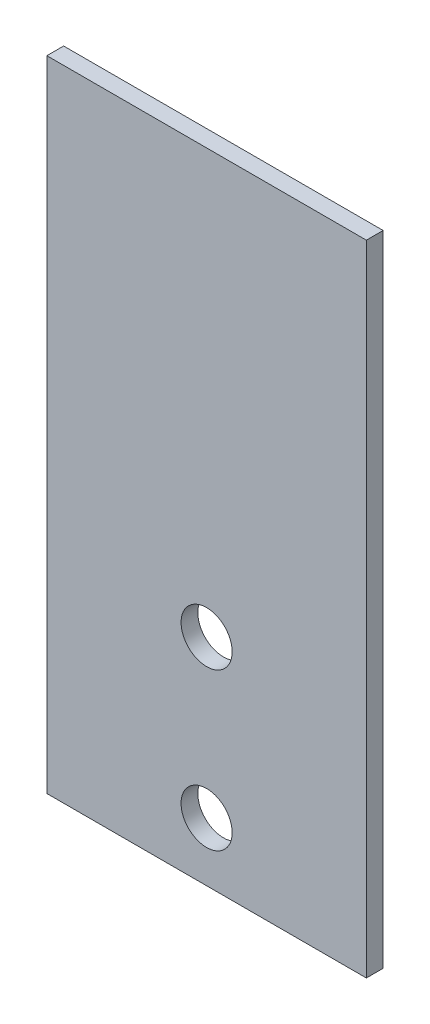
ISO-10303-21;
HEADER;
FILE_DESCRIPTION(('STEP AP214'),'2;1');
FILE_NAME('part.step','',(''),(''),'','','');
FILE_SCHEMA(('AUTOMOTIVE_DESIGN { 1 0 10303 214 1 1 1 1 }'));
ENDSEC;
DATA;
#1=APPLICATION_CONTEXT('core data for automotive mechanical design processes');
#2=APPLICATION_PROTOCOL_DEFINITION('international standard','automotive_design',2000,#1);
#3=PRODUCT_CONTEXT('',#1,'mechanical');
#4=PRODUCT('Part','Part','',(#3));
#5=PRODUCT_RELATED_PRODUCT_CATEGORY('part','',(#4));
#6=PRODUCT_DEFINITION_FORMATION('','',#4);
#7=PRODUCT_DEFINITION_CONTEXT('part definition',#1,'design');
#8=PRODUCT_DEFINITION('design','',#6,#7);
#9=PRODUCT_DEFINITION_SHAPE('','',#8);
#10=(LENGTH_UNIT() NAMED_UNIT(*) SI_UNIT(.MILLI.,.METRE.));
#11=(NAMED_UNIT(*) PLANE_ANGLE_UNIT() SI_UNIT($,.RADIAN.));
#12=(NAMED_UNIT(*) SI_UNIT($,.STERADIAN.) SOLID_ANGLE_UNIT());
#13=UNCERTAINTY_MEASURE_WITH_UNIT(LENGTH_MEASURE(1.E-05),#10,'distance_accuracy_value','');
#14=(GEOMETRIC_REPRESENTATION_CONTEXT(3) GLOBAL_UNCERTAINTY_ASSIGNED_CONTEXT((#13)) GLOBAL_UNIT_ASSIGNED_CONTEXT((#10,
#11,#12)) REPRESENTATION_CONTEXT('',''));
#15=CARTESIAN_POINT('',(0.,0.,0.));
#16=DIRECTION('',(0.,0.,1.));
#17=DIRECTION('',(1.,0.,0.));
#18=AXIS2_PLACEMENT_3D('',#15,#16,#17);
#19=CARTESIAN_POINT('',(-9.525,58.592,1.));
#20=DIRECTION('',(0.,0.,-1.));
#21=DIRECTION('',(-1.,0.,0.));
#22=AXIS2_PLACEMENT_3D('',#19,#20,#21);
#23=PLANE('',#22);
#24=CARTESIAN_POINT('',(0.,33.332,1.));
#25=DIRECTION('',(0.,0.,1.));
#26=DIRECTION('',(1.,0.,0.));
#27=AXIS2_PLACEMENT_3D('',#24,#25,#26);
#28=CIRCLE('',#27,1.524);
#29=CARTESIAN_POINT('',(1.52400000000005,33.332,1.));
#30=VERTEX_POINT('',#29);
#31=EDGE_CURVE('E98',#30,#30,#28,.T.);
#32=ORIENTED_EDGE('',*,*,#31,.F.);
#33=EDGE_LOOP('',(#32));
#34=FACE_BOUND('',#33,.T.);
#35=DIRECTION('',(0.,-1.,0.));
#36=VECTOR('',#35,1.);
#37=CARTESIAN_POINT('',(-9.525,20.492,1.));
#38=LINE('',#37,#36);
#39=CARTESIAN_POINT('',(-9.525,58.592,1.));
#40=VERTEX_POINT('',#39);
#41=CARTESIAN_POINT('',(-9.525,20.492,1.));
#42=VERTEX_POINT('',#41);
#43=EDGE_CURVE('E83',#40,#42,#38,.T.);
#44=ORIENTED_EDGE('',*,*,#43,.T.);
#45=DIRECTION('',(1.,0.,0.));
#46=VECTOR('',#45,1.);
#47=CARTESIAN_POINT('',(-9.525,20.492,1.));
#48=LINE('',#47,#46);
#49=CARTESIAN_POINT('',(9.525,20.492,1.));
#50=VERTEX_POINT('',#49);
#51=EDGE_CURVE('E78',#42,#50,#48,.T.);
#52=ORIENTED_EDGE('',*,*,#51,.T.);
#53=DIRECTION('',(0.,1.,0.));
#54=VECTOR('',#53,1.);
#55=CARTESIAN_POINT('',(9.525,20.492,1.));
#56=LINE('',#55,#54);
#57=CARTESIAN_POINT('',(9.525,58.592,1.));
#58=VERTEX_POINT('',#57);
#59=EDGE_CURVE('E81',#50,#58,#56,.T.);
#60=ORIENTED_EDGE('',*,*,#59,.T.);
#61=DIRECTION('',(-1.,0.,0.));
#62=VECTOR('',#61,1.);
#63=CARTESIAN_POINT('',(-9.525,58.592,1.));
#64=LINE('',#63,#62);
#65=EDGE_CURVE('E48',#58,#40,#64,.T.);
#66=ORIENTED_EDGE('',*,*,#65,.T.);
#67=EDGE_LOOP('',(#44,#52,#60,#66));
#68=FACE_BOUND('',#67,.T.);
#69=CARTESIAN_POINT('',(0.,23.992,1.));
#70=DIRECTION('',(0.,0.,1.));
#71=DIRECTION('',(1.,0.,0.));
#72=AXIS2_PLACEMENT_3D('',#69,#70,#71);
#73=CIRCLE('',#72,1.524);
#74=CARTESIAN_POINT('',(1.52400000000005,23.992,1.));
#75=VERTEX_POINT('',#74);
#76=EDGE_CURVE('E113',#75,#75,#73,.T.);
#77=ORIENTED_EDGE('',*,*,#76,.F.);
#78=EDGE_LOOP('',(#77));
#79=FACE_BOUND('',#78,.T.);
#80=ADVANCED_FACE('F31',(#34,#68,#79),#23,.F.);
#81=CARTESIAN_POINT('',(-9.525,58.592,0.));
#82=DIRECTION('',(0.,0.,-1.));
#83=DIRECTION('',(-1.,0.,0.));
#84=AXIS2_PLACEMENT_3D('',#81,#82,#83);
#85=PLANE('',#84);
#86=CARTESIAN_POINT('',(0.,33.332,0.));
#87=DIRECTION('',(0.,0.,1.));
#88=DIRECTION('',(1.,0.,0.));
#89=AXIS2_PLACEMENT_3D('',#86,#87,#88);
#90=CIRCLE('',#89,1.524);
#91=CARTESIAN_POINT('',(1.52400000000005,33.332,0.));
#92=VERTEX_POINT('',#91);
#93=EDGE_CURVE('E110',#92,#92,#90,.T.);
#94=ORIENTED_EDGE('',*,*,#93,.T.);
#95=EDGE_LOOP('',(#94));
#96=FACE_BOUND('',#95,.T.);
#97=DIRECTION('',(0.,-1.,0.));
#98=VECTOR('',#97,1.);
#99=CARTESIAN_POINT('',(-9.525,20.492,0.));
#100=LINE('',#99,#98);
#101=CARTESIAN_POINT('',(-9.525,58.592,0.));
#102=VERTEX_POINT('',#101);
#103=CARTESIAN_POINT('',(-9.525,20.492,0.));
#104=VERTEX_POINT('',#103);
#105=EDGE_CURVE('E95',#102,#104,#100,.T.);
#106=ORIENTED_EDGE('',*,*,#105,.F.);
#107=DIRECTION('',(-1.,0.,0.));
#108=VECTOR('',#107,1.);
#109=CARTESIAN_POINT('',(-9.525,58.592,0.));
#110=LINE('',#109,#108);
#111=CARTESIAN_POINT('',(9.525,58.592,0.));
#112=VERTEX_POINT('',#111);
#113=EDGE_CURVE('E71',#112,#102,#110,.T.);
#114=ORIENTED_EDGE('',*,*,#113,.F.);
#115=DIRECTION('',(0.,1.,0.));
#116=VECTOR('',#115,1.);
#117=CARTESIAN_POINT('',(9.525,20.492,0.));
#118=LINE('',#117,#116);
#119=CARTESIAN_POINT('',(9.525,20.492,0.));
#120=VERTEX_POINT('',#119);
#121=EDGE_CURVE('E65',#120,#112,#118,.T.);
#122=ORIENTED_EDGE('',*,*,#121,.F.);
#123=DIRECTION('',(1.,0.,0.));
#124=VECTOR('',#123,1.);
#125=CARTESIAN_POINT('',(-9.525,20.492,0.));
#126=LINE('',#125,#124);
#127=EDGE_CURVE('E87',#104,#120,#126,.T.);
#128=ORIENTED_EDGE('',*,*,#127,.F.);
#129=EDGE_LOOP('',(#106,#114,#122,#128));
#130=FACE_BOUND('',#129,.T.);
#131=CARTESIAN_POINT('',(0.,23.992,0.));
#132=DIRECTION('',(0.,0.,1.));
#133=DIRECTION('',(1.,0.,0.));
#134=AXIS2_PLACEMENT_3D('',#131,#132,#133);
#135=CIRCLE('',#134,1.524);
#136=CARTESIAN_POINT('',(1.52400000000005,23.992,0.));
#137=VERTEX_POINT('',#136);
#138=EDGE_CURVE('E116',#137,#137,#135,.T.);
#139=ORIENTED_EDGE('',*,*,#138,.T.);
#140=EDGE_LOOP('',(#139));
#141=FACE_BOUND('',#140,.T.);
#142=ADVANCED_FACE('F106',(#96,#130,#141),#85,.T.);
#143=CARTESIAN_POINT('',(-9.525,20.492,1.));
#144=DIRECTION('',(1.,0.,0.));
#145=DIRECTION('',(0.,0.,-1.));
#146=AXIS2_PLACEMENT_3D('',#143,#144,#145);
#147=PLANE('',#146);
#148=ORIENTED_EDGE('',*,*,#105,.T.);
#149=DIRECTION('',(0.,0.,-1.));
#150=VECTOR('',#149,1.);
#151=CARTESIAN_POINT('',(-9.525,20.492,1.));
#152=LINE('',#151,#150);
#153=EDGE_CURVE('E11',#42,#104,#152,.T.);
#154=ORIENTED_EDGE('',*,*,#153,.F.);
#155=ORIENTED_EDGE('',*,*,#43,.F.);
#156=DIRECTION('',(0.,0.,-1.));
#157=VECTOR('',#156,1.);
#158=CARTESIAN_POINT('',(-9.525,58.592,1.));
#159=LINE('',#158,#157);
#160=EDGE_CURVE('E91',#40,#102,#159,.T.);
#161=ORIENTED_EDGE('',*,*,#160,.T.);
#162=EDGE_LOOP('',(#148,#154,#155,#161));
#163=FACE_BOUND('',#162,.T.);
#164=ADVANCED_FACE('F33',(#163),#147,.F.);
#165=CARTESIAN_POINT('',(-9.525,20.492,1.));
#166=DIRECTION('',(0.,1.,0.));
#167=DIRECTION('',(0.,0.,1.));
#168=AXIS2_PLACEMENT_3D('',#165,#166,#167);
#169=PLANE('',#168);
#170=ORIENTED_EDGE('',*,*,#127,.T.);
#171=DIRECTION('',(0.,0.,-1.));
#172=VECTOR('',#171,1.);
#173=CARTESIAN_POINT('',(9.525,20.492,1.));
#174=LINE('',#173,#172);
#175=EDGE_CURVE('E40',#50,#120,#174,.T.);
#176=ORIENTED_EDGE('',*,*,#175,.F.);
#177=ORIENTED_EDGE('',*,*,#51,.F.);
#178=ORIENTED_EDGE('',*,*,#153,.T.);
#179=EDGE_LOOP('',(#170,#176,#177,#178));
#180=FACE_BOUND('',#179,.T.);
#181=ADVANCED_FACE('F86',(#180),#169,.F.);
#182=CARTESIAN_POINT('',(9.525,20.492,1.));
#183=DIRECTION('',(-1.,0.,0.));
#184=DIRECTION('',(0.,0.,1.));
#185=AXIS2_PLACEMENT_3D('',#182,#183,#184);
#186=PLANE('',#185);
#187=ORIENTED_EDGE('',*,*,#121,.T.);
#188=DIRECTION('',(0.,0.,-1.));
#189=VECTOR('',#188,1.);
#190=CARTESIAN_POINT('',(9.525,58.592,1.));
#191=LINE('',#190,#189);
#192=EDGE_CURVE('E88',#58,#112,#191,.T.);
#193=ORIENTED_EDGE('',*,*,#192,.F.);
#194=ORIENTED_EDGE('',*,*,#59,.F.);
#195=ORIENTED_EDGE('',*,*,#175,.T.);
#196=EDGE_LOOP('',(#187,#193,#194,#195));
#197=FACE_BOUND('',#196,.T.);
#198=ADVANCED_FACE('F89',(#197),#186,.F.);
#199=CARTESIAN_POINT('',(-9.525,58.592,1.));
#200=DIRECTION('',(0.,-1.,0.));
#201=DIRECTION('',(0.,0.,-1.));
#202=AXIS2_PLACEMENT_3D('',#199,#200,#201);
#203=PLANE('',#202);
#204=ORIENTED_EDGE('',*,*,#113,.T.);
#205=ORIENTED_EDGE('',*,*,#160,.F.);
#206=ORIENTED_EDGE('',*,*,#65,.F.);
#207=ORIENTED_EDGE('',*,*,#192,.T.);
#208=EDGE_LOOP('',(#204,#205,#206,#207));
#209=FACE_BOUND('',#208,.T.);
#210=ADVANCED_FACE('F103',(#209),#203,.F.);
#211=CARTESIAN_POINT('',(0.,33.332,1.));
#212=DIRECTION('',(0.,0.,-1.));
#213=DIRECTION('',(-1.,0.,0.));
#214=AXIS2_PLACEMENT_3D('',#211,#212,#213);
#215=CYLINDRICAL_SURFACE('',#214,1.524);
#216=ORIENTED_EDGE('',*,*,#31,.T.);
#217=EDGE_LOOP('',(#216));
#218=FACE_BOUND('',#217,.T.);
#219=ORIENTED_EDGE('',*,*,#93,.F.);
#220=EDGE_LOOP('',(#219));
#221=FACE_BOUND('',#220,.T.);
#222=ADVANCED_FACE('F134',(#218,#221),#215,.F.);
#223=CARTESIAN_POINT('',(0.,23.992,1.));
#224=DIRECTION('',(0.,0.,-1.));
#225=DIRECTION('',(-1.,0.,0.));
#226=AXIS2_PLACEMENT_3D('',#223,#224,#225);
#227=CYLINDRICAL_SURFACE('',#226,1.524);
#228=ORIENTED_EDGE('',*,*,#76,.T.);
#229=EDGE_LOOP('',(#228));
#230=FACE_BOUND('',#229,.T.);
#231=ORIENTED_EDGE('',*,*,#138,.F.);
#232=EDGE_LOOP('',(#231));
#233=FACE_BOUND('',#232,.T.);
#234=ADVANCED_FACE('F122',(#230,#233),#227,.F.);
#235=CLOSED_SHELL('',(#80,#142,#164,#181,#198,#210,#222,#234));
#236=MANIFOLD_SOLID_BREP('B2',#235);
#237=ADVANCED_BREP_SHAPE_REPRESENTATION('',(#18,#236),#14);
#238=SHAPE_DEFINITION_REPRESENTATION(#9,#237);
ENDSEC;
END-ISO-10303-21;
